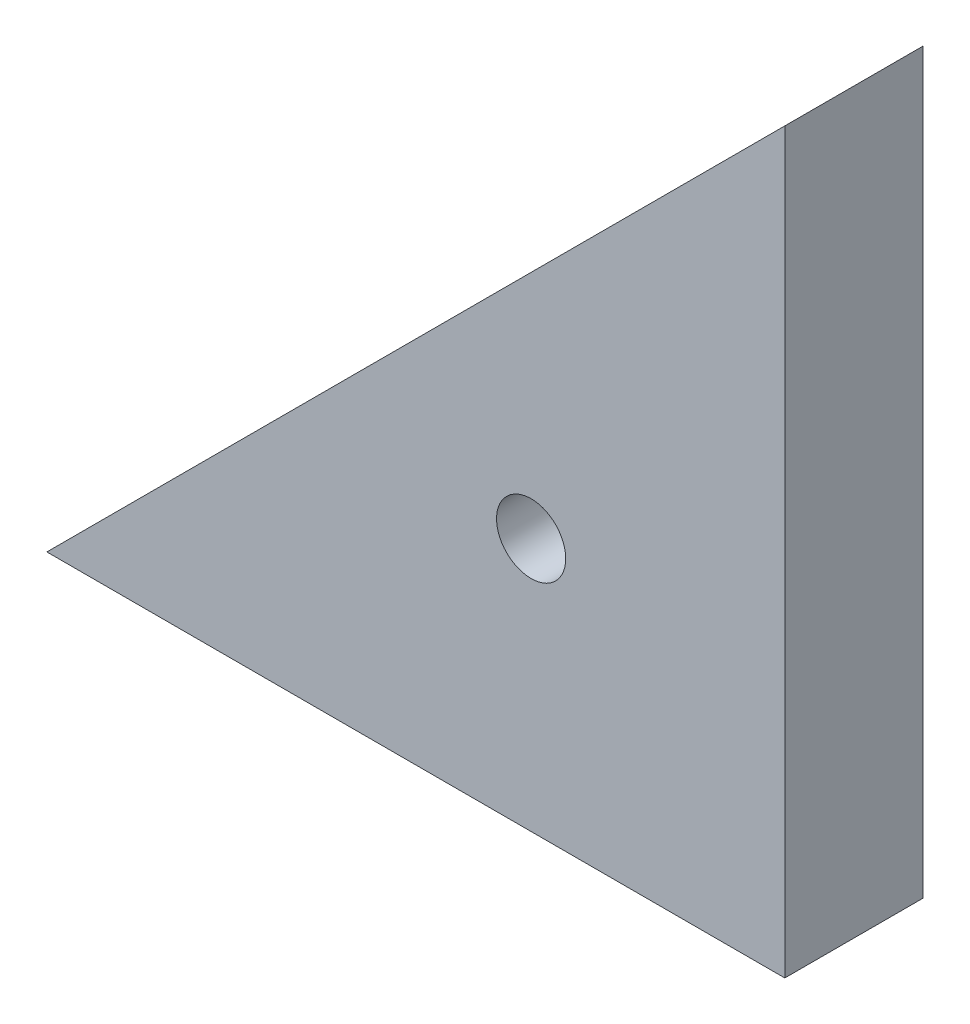
ISO-10303-21;
HEADER;
FILE_DESCRIPTION(('STEP AP214'),'2;1');
FILE_NAME('part.step','',(''),(''),'','','');
FILE_SCHEMA(('AUTOMOTIVE_DESIGN { 1 0 10303 214 1 1 1 1 }'));
ENDSEC;
DATA;
#1=APPLICATION_CONTEXT('core data for automotive mechanical design processes');
#2=APPLICATION_PROTOCOL_DEFINITION('international standard','automotive_design',2000,#1);
#3=PRODUCT_CONTEXT('',#1,'mechanical');
#4=PRODUCT('Part','Part','',(#3));
#5=PRODUCT_RELATED_PRODUCT_CATEGORY('part','',(#4));
#6=PRODUCT_DEFINITION_FORMATION('','',#4);
#7=PRODUCT_DEFINITION_CONTEXT('part definition',#1,'design');
#8=PRODUCT_DEFINITION('design','',#6,#7);
#9=PRODUCT_DEFINITION_SHAPE('','',#8);
#10=(LENGTH_UNIT() NAMED_UNIT(*) SI_UNIT(.MILLI.,.METRE.));
#11=(NAMED_UNIT(*) PLANE_ANGLE_UNIT() SI_UNIT($,.RADIAN.));
#12=(NAMED_UNIT(*) SI_UNIT($,.STERADIAN.) SOLID_ANGLE_UNIT());
#13=UNCERTAINTY_MEASURE_WITH_UNIT(LENGTH_MEASURE(1.E-05),#10,'distance_accuracy_value','');
#14=(GEOMETRIC_REPRESENTATION_CONTEXT(3) GLOBAL_UNCERTAINTY_ASSIGNED_CONTEXT((#13)) GLOBAL_UNIT_ASSIGNED_CONTEXT((#10,
#11,#12)) REPRESENTATION_CONTEXT('',''));
#15=CARTESIAN_POINT('',(0.,0.,0.));
#16=DIRECTION('',(0.,0.,1.));
#17=DIRECTION('',(1.,0.,0.));
#18=AXIS2_PLACEMENT_3D('',#15,#16,#17);
#19=CARTESIAN_POINT('',(0.,0.,6.));
#20=DIRECTION('',(0.,0.,1.));
#21=DIRECTION('',(1.,0.,0.));
#22=AXIS2_PLACEMENT_3D('',#19,#20,#21);
#23=PLANE('',#22);
#24=DIRECTION('',(-0.707106781186548,-0.707106781186548,0.));
#25=VECTOR('',#24,1.);
#26=CARTESIAN_POINT('',(16.,32.,6.));
#27=LINE('',#26,#25);
#28=CARTESIAN_POINT('',(16.,32.,6.));
#29=VERTEX_POINT('',#28);
#30=CARTESIAN_POINT('',(-16.,0.,6.));
#31=VERTEX_POINT('',#30);
#32=EDGE_CURVE('E76',#29,#31,#27,.T.);
#33=ORIENTED_EDGE('',*,*,#32,.T.);
#34=DIRECTION('',(1.,0.,0.));
#35=VECTOR('',#34,1.);
#36=CARTESIAN_POINT('',(-16.,0.,6.));
#37=LINE('',#36,#35);
#38=CARTESIAN_POINT('',(16.,0.,6.));
#39=VERTEX_POINT('',#38);
#40=EDGE_CURVE('E72',#31,#39,#37,.T.);
#41=ORIENTED_EDGE('',*,*,#40,.T.);
#42=DIRECTION('',(0.,1.,0.));
#43=VECTOR('',#42,1.);
#44=CARTESIAN_POINT('',(16.,0.,6.));
#45=LINE('',#44,#43);
#46=EDGE_CURVE('E52',#39,#29,#45,.T.);
#47=ORIENTED_EDGE('',*,*,#46,.T.);
#48=EDGE_LOOP('',(#33,#41,#47));
#49=FACE_BOUND('',#48,.T.);
#50=CARTESIAN_POINT('',(5.,11.,6.));
#51=DIRECTION('',(0.,0.,1.));
#52=DIRECTION('',(1.,0.,0.));
#53=AXIS2_PLACEMENT_3D('',#50,#51,#52);
#54=CIRCLE('',#53,1.5);
#55=CARTESIAN_POINT('',(6.50000000000001,11.,6.));
#56=VERTEX_POINT('',#55);
#57=EDGE_CURVE('E86',#56,#56,#54,.T.);
#58=ORIENTED_EDGE('',*,*,#57,.F.);
#59=EDGE_LOOP('',(#58));
#60=FACE_BOUND('',#59,.T.);
#61=ADVANCED_FACE('F35',(#49,#60),#23,.T.);
#62=CARTESIAN_POINT('',(0.,0.,0.));
#63=DIRECTION('',(0.,0.,1.));
#64=DIRECTION('',(1.,0.,0.));
#65=AXIS2_PLACEMENT_3D('',#62,#63,#64);
#66=PLANE('',#65);
#67=DIRECTION('',(-0.707106781186548,-0.707106781186548,0.));
#68=VECTOR('',#67,1.);
#69=CARTESIAN_POINT('',(16.,32.,0.));
#70=LINE('',#69,#68);
#71=CARTESIAN_POINT('',(16.,32.,0.));
#72=VERTEX_POINT('',#71);
#73=CARTESIAN_POINT('',(-16.,0.,0.));
#74=VERTEX_POINT('',#73);
#75=EDGE_CURVE('E83',#72,#74,#70,.T.);
#76=ORIENTED_EDGE('',*,*,#75,.F.);
#77=DIRECTION('',(0.,1.,0.));
#78=VECTOR('',#77,1.);
#79=CARTESIAN_POINT('',(16.,0.,0.));
#80=LINE('',#79,#78);
#81=CARTESIAN_POINT('',(16.,0.,0.));
#82=VERTEX_POINT('',#81);
#83=EDGE_CURVE('E69',#82,#72,#80,.T.);
#84=ORIENTED_EDGE('',*,*,#83,.F.);
#85=DIRECTION('',(1.,0.,0.));
#86=VECTOR('',#85,1.);
#87=CARTESIAN_POINT('',(-16.,0.,0.));
#88=LINE('',#87,#86);
#89=EDGE_CURVE('E64',#74,#82,#88,.T.);
#90=ORIENTED_EDGE('',*,*,#89,.F.);
#91=EDGE_LOOP('',(#76,#84,#90));
#92=FACE_BOUND('',#91,.T.);
#93=CARTESIAN_POINT('',(5.,11.,0.));
#94=DIRECTION('',(0.,0.,1.));
#95=DIRECTION('',(1.,0.,0.));
#96=AXIS2_PLACEMENT_3D('',#93,#94,#95);
#97=CIRCLE('',#96,1.5);
#98=CARTESIAN_POINT('',(6.50000000000001,11.,0.));
#99=VERTEX_POINT('',#98);
#100=EDGE_CURVE('E90',#99,#99,#97,.T.);
#101=ORIENTED_EDGE('',*,*,#100,.T.);
#102=EDGE_LOOP('',(#101));
#103=FACE_BOUND('',#102,.T.);
#104=ADVANCED_FACE('F96',(#92,#103),#66,.F.);
#105=CARTESIAN_POINT('',(16.,32.,6.));
#106=DIRECTION('',(0.707106781186547,-0.707106781186547,0.));
#107=DIRECTION('',(0.707106781186548,0.707106781186548,0.));
#108=AXIS2_PLACEMENT_3D('',#105,#106,#107);
#109=PLANE('',#108);
#110=ORIENTED_EDGE('',*,*,#75,.T.);
#111=DIRECTION('',(0.,0.,-1.));
#112=VECTOR('',#111,1.);
#113=CARTESIAN_POINT('',(-16.,0.,6.));
#114=LINE('',#113,#112);
#115=EDGE_CURVE('E11',#31,#74,#114,.T.);
#116=ORIENTED_EDGE('',*,*,#115,.F.);
#117=ORIENTED_EDGE('',*,*,#32,.F.);
#118=DIRECTION('',(0.,0.,-1.));
#119=VECTOR('',#118,1.);
#120=CARTESIAN_POINT('',(16.,32.,6.));
#121=LINE('',#120,#119);
#122=EDGE_CURVE('E84',#29,#72,#121,.T.);
#123=ORIENTED_EDGE('',*,*,#122,.T.);
#124=EDGE_LOOP('',(#110,#116,#117,#123));
#125=FACE_BOUND('',#124,.T.);
#126=ADVANCED_FACE('F37',(#125),#109,.F.);
#127=CARTESIAN_POINT('',(-16.,0.,6.));
#128=DIRECTION('',(0.,1.,0.));
#129=DIRECTION('',(0.,0.,1.));
#130=AXIS2_PLACEMENT_3D('',#127,#128,#129);
#131=PLANE('',#130);
#132=ORIENTED_EDGE('',*,*,#89,.T.);
#133=DIRECTION('',(0.,0.,-1.));
#134=VECTOR('',#133,1.);
#135=CARTESIAN_POINT('',(16.,0.,6.));
#136=LINE('',#135,#134);
#137=EDGE_CURVE('E44',#39,#82,#136,.T.);
#138=ORIENTED_EDGE('',*,*,#137,.F.);
#139=ORIENTED_EDGE('',*,*,#40,.F.);
#140=ORIENTED_EDGE('',*,*,#115,.T.);
#141=EDGE_LOOP('',(#132,#138,#139,#140));
#142=FACE_BOUND('',#141,.T.);
#143=ADVANCED_FACE('F73',(#142),#131,.F.);
#144=CARTESIAN_POINT('',(16.,0.,6.));
#145=DIRECTION('',(-1.,0.,0.));
#146=DIRECTION('',(0.,0.,1.));
#147=AXIS2_PLACEMENT_3D('',#144,#145,#146);
#148=PLANE('',#147);
#149=ORIENTED_EDGE('',*,*,#83,.T.);
#150=ORIENTED_EDGE('',*,*,#122,.F.);
#151=ORIENTED_EDGE('',*,*,#46,.F.);
#152=ORIENTED_EDGE('',*,*,#137,.T.);
#153=EDGE_LOOP('',(#149,#150,#151,#152));
#154=FACE_BOUND('',#153,.T.);
#155=ADVANCED_FACE('F95',(#154),#148,.F.);
#156=CARTESIAN_POINT('',(5.,11.,6.));
#157=DIRECTION('',(0.,0.,-1.));
#158=DIRECTION('',(-1.,0.,0.));
#159=AXIS2_PLACEMENT_3D('',#156,#157,#158);
#160=CYLINDRICAL_SURFACE('',#159,1.5);
#161=ORIENTED_EDGE('',*,*,#57,.T.);
#162=EDGE_LOOP('',(#161));
#163=FACE_BOUND('',#162,.T.);
#164=ORIENTED_EDGE('',*,*,#100,.F.);
#165=EDGE_LOOP('',(#164));
#166=FACE_BOUND('',#165,.T.);
#167=ADVANCED_FACE('F104',(#163,#166),#160,.F.);
#168=CLOSED_SHELL('',(#61,#104,#126,#143,#155,#167));
#169=MANIFOLD_SOLID_BREP('B2',#168);
#170=ADVANCED_BREP_SHAPE_REPRESENTATION('',(#18,#169),#14);
#171=SHAPE_DEFINITION_REPRESENTATION(#9,#170);
ENDSEC;
END-ISO-10303-21;
